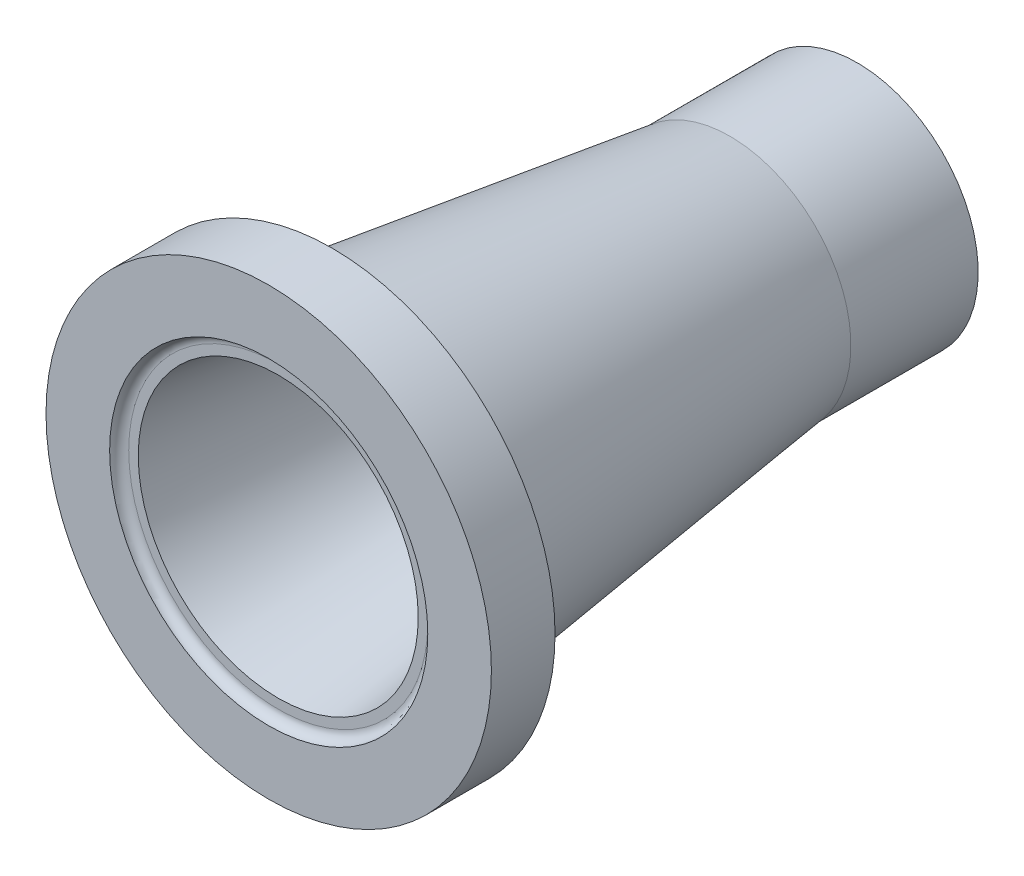
ISO-10303-21;
HEADER;
FILE_DESCRIPTION(('STEP AP214'),'2;1');
FILE_NAME('part.step','',(''),(''),'','','');
FILE_SCHEMA(('AUTOMOTIVE_DESIGN { 1 0 10303 214 1 1 1 1 }'));
ENDSEC;
DATA;
#1=APPLICATION_CONTEXT('core data for automotive mechanical design processes');
#2=APPLICATION_PROTOCOL_DEFINITION('international standard','automotive_design',2000,#1);
#3=PRODUCT_CONTEXT('',#1,'mechanical');
#4=PRODUCT('Part','Part','',(#3));
#5=PRODUCT_RELATED_PRODUCT_CATEGORY('part','',(#4));
#6=PRODUCT_DEFINITION_FORMATION('','',#4);
#7=PRODUCT_DEFINITION_CONTEXT('part definition',#1,'design');
#8=PRODUCT_DEFINITION('design','',#6,#7);
#9=PRODUCT_DEFINITION_SHAPE('','',#8);
#10=(LENGTH_UNIT() NAMED_UNIT(*) SI_UNIT(.MILLI.,.METRE.));
#11=(NAMED_UNIT(*) PLANE_ANGLE_UNIT() SI_UNIT($,.RADIAN.));
#12=(NAMED_UNIT(*) SI_UNIT($,.STERADIAN.) SOLID_ANGLE_UNIT());
#13=UNCERTAINTY_MEASURE_WITH_UNIT(LENGTH_MEASURE(1.E-05),#10,'distance_accuracy_value','');
#14=(GEOMETRIC_REPRESENTATION_CONTEXT(3) GLOBAL_UNCERTAINTY_ASSIGNED_CONTEXT((#13)) GLOBAL_UNIT_ASSIGNED_CONTEXT((#10,
#11,#12)) REPRESENTATION_CONTEXT('',''));
#15=CARTESIAN_POINT('',(0.,0.,0.));
#16=DIRECTION('',(0.,0.,1.));
#17=DIRECTION('',(1.,0.,0.));
#18=AXIS2_PLACEMENT_3D('',#15,#16,#17);
#19=CARTESIAN_POINT('',(50.,0.,0.));
#20=DIRECTION('',(0.,0.,-1.));
#21=DIRECTION('',(-1.,0.,0.));
#22=AXIS2_PLACEMENT_3D('',#19,#20,#21);
#23=PLANE('',#22);
#24=CARTESIAN_POINT('',(0.,0.,0.));
#25=DIRECTION('',(0.,0.,-1.));
#26=DIRECTION('',(-1.,0.,0.));
#27=AXIS2_PLACEMENT_3D('',#24,#25,#26);
#28=CIRCLE('',#27,70.);
#29=CARTESIAN_POINT('',(-70.,0.,0.));
#30=VERTEX_POINT('',#29);
#31=EDGE_CURVE('E76',#30,#30,#28,.T.);
#32=ORIENTED_EDGE('',*,*,#31,.F.);
#33=EDGE_LOOP('',(#32));
#34=FACE_BOUND('',#33,.T.);
#35=CARTESIAN_POINT('',(0.,0.,0.));
#36=DIRECTION('',(0.,0.,-1.));
#37=DIRECTION('',(-1.,0.,0.));
#38=AXIS2_PLACEMENT_3D('',#35,#36,#37);
#39=CIRCLE('',#38,50.);
#40=CARTESIAN_POINT('',(-50.,0.,0.));
#41=VERTEX_POINT('',#40);
#42=EDGE_CURVE('E10',#41,#41,#39,.T.);
#43=ORIENTED_EDGE('',*,*,#42,.T.);
#44=EDGE_LOOP('',(#43));
#45=FACE_BOUND('',#44,.T.);
#46=ADVANCED_FACE('F39',(#34,#45),#23,.F.);
#47=CARTESIAN_POINT('',(0.,0.,0.));
#48=DIRECTION('',(0.,0.,-1.));
#49=DIRECTION('',(-1.,0.,0.));
#50=AXIS2_PLACEMENT_3D('',#47,#48,#49);
#51=TOROIDAL_SURFACE('',#50,47.,3.);
#52=ORIENTED_EDGE('',*,*,#42,.F.);
#53=EDGE_LOOP('',(#52));
#54=FACE_BOUND('',#53,.T.);
#55=CARTESIAN_POINT('',(0.,0.,-3.));
#56=DIRECTION('',(0.,0.,-1.));
#57=DIRECTION('',(-1.,0.,0.));
#58=AXIS2_PLACEMENT_3D('',#55,#56,#57);
#59=CIRCLE('',#58,47.);
#60=CARTESIAN_POINT('',(-47.,0.,-3.));
#61=VERTEX_POINT('',#60);
#62=EDGE_CURVE('E45',#61,#61,#59,.T.);
#63=ORIENTED_EDGE('',*,*,#62,.T.);
#64=EDGE_LOOP('',(#63));
#65=FACE_BOUND('',#64,.T.);
#66=ADVANCED_FACE('F83',(#54,#65),#51,.F.);
#67=CARTESIAN_POINT('',(44.,0.,-3.));
#68=DIRECTION('',(0.,0.,-1.));
#69=DIRECTION('',(-1.,0.,0.));
#70=AXIS2_PLACEMENT_3D('',#67,#68,#69);
#71=PLANE('',#70);
#72=ORIENTED_EDGE('',*,*,#62,.F.);
#73=EDGE_LOOP('',(#72));
#74=FACE_BOUND('',#73,.T.);
#75=CARTESIAN_POINT('',(0.,0.,-3.));
#76=DIRECTION('',(0.,0.,-1.));
#77=DIRECTION('',(-1.,0.,0.));
#78=AXIS2_PLACEMENT_3D('',#75,#76,#77);
#79=CIRCLE('',#78,44.);
#80=CARTESIAN_POINT('',(-44.,0.,-3.));
#81=VERTEX_POINT('',#80);
#82=EDGE_CURVE('E49',#81,#81,#79,.T.);
#83=ORIENTED_EDGE('',*,*,#82,.T.);
#84=EDGE_LOOP('',(#83));
#85=FACE_BOUND('',#84,.T.);
#86=ADVANCED_FACE('F87',(#74,#85),#71,.F.);
#87=CARTESIAN_POINT('',(0.,0.,-145.));
#88=DIRECTION('',(0.,0.,1.));
#89=DIRECTION('',(1.,0.,0.));
#90=AXIS2_PLACEMENT_3D('',#87,#88,#89);
#91=CONICAL_SURFACE('',#90,25.,0.133012786876509);
#92=ORIENTED_EDGE('',*,*,#82,.F.);
#93=EDGE_LOOP('',(#92));
#94=FACE_BOUND('',#93,.T.);
#95=CARTESIAN_POINT('',(0.,0.,-145.));
#96=DIRECTION('',(0.,0.,-1.));
#97=DIRECTION('',(-1.,0.,0.));
#98=AXIS2_PLACEMENT_3D('',#95,#96,#97);
#99=CIRCLE('',#98,25.);
#100=CARTESIAN_POINT('',(-25.,0.,-145.));
#101=VERTEX_POINT('',#100);
#102=EDGE_CURVE('E53',#101,#101,#99,.T.);
#103=ORIENTED_EDGE('',*,*,#102,.T.);
#104=EDGE_LOOP('',(#103));
#105=FACE_BOUND('',#104,.T.);
#106=ADVANCED_FACE('F92',(#94,#105),#91,.F.);
#107=CARTESIAN_POINT('',(0.,0.,-195.70547790521));
#108=DIRECTION('',(0.,0.,-1.));
#109=DIRECTION('',(-1.,0.,0.));
#110=AXIS2_PLACEMENT_3D('',#107,#108,#109);
#111=CYLINDRICAL_SURFACE('',#110,25.);
#112=ORIENTED_EDGE('',*,*,#102,.F.);
#113=EDGE_LOOP('',(#112));
#114=FACE_BOUND('',#113,.T.);
#115=CARTESIAN_POINT('',(0.,0.,-185.));
#116=DIRECTION('',(0.,0.,-1.));
#117=DIRECTION('',(-1.,0.,0.));
#118=AXIS2_PLACEMENT_3D('',#115,#116,#117);
#119=CIRCLE('',#118,25.);
#120=CARTESIAN_POINT('',(-25.,0.,-185.));
#121=VERTEX_POINT('',#120);
#122=EDGE_CURVE('E58',#121,#121,#119,.T.);
#123=ORIENTED_EDGE('',*,*,#122,.T.);
#124=EDGE_LOOP('',(#123));
#125=FACE_BOUND('',#124,.T.);
#126=ADVANCED_FACE('F98',(#114,#125),#111,.F.);
#127=CARTESIAN_POINT('',(25.,0.,-185.));
#128=DIRECTION('',(0.,0.,1.));
#129=DIRECTION('',(1.,0.,0.));
#130=AXIS2_PLACEMENT_3D('',#127,#128,#129);
#131=PLANE('',#130);
#132=ORIENTED_EDGE('',*,*,#122,.F.);
#133=EDGE_LOOP('',(#132));
#134=FACE_BOUND('',#133,.T.);
#135=CARTESIAN_POINT('',(0.,0.,-185.));
#136=DIRECTION('',(0.,0.,-1.));
#137=DIRECTION('',(-1.,0.,0.));
#138=AXIS2_PLACEMENT_3D('',#135,#136,#137);
#139=CIRCLE('',#138,38.);
#140=CARTESIAN_POINT('',(-38.,0.,-185.));
#141=VERTEX_POINT('',#140);
#142=EDGE_CURVE('E61',#141,#141,#139,.T.);
#143=ORIENTED_EDGE('',*,*,#142,.T.);
#144=EDGE_LOOP('',(#143));
#145=FACE_BOUND('',#144,.T.);
#146=ADVANCED_FACE('F102',(#134,#145),#131,.F.);
#147=CARTESIAN_POINT('',(0.,0.,-195.70547790521));
#148=DIRECTION('',(0.,0.,-1.));
#149=DIRECTION('',(-1.,0.,0.));
#150=AXIS2_PLACEMENT_3D('',#147,#148,#149);
#151=CYLINDRICAL_SURFACE('',#150,38.);
#152=ORIENTED_EDGE('',*,*,#142,.F.);
#153=EDGE_LOOP('',(#152));
#154=FACE_BOUND('',#153,.T.);
#155=CARTESIAN_POINT('',(0.,0.,-145.));
#156=DIRECTION('',(0.,0.,-1.));
#157=DIRECTION('',(-1.,0.,0.));
#158=AXIS2_PLACEMENT_3D('',#155,#156,#157);
#159=CIRCLE('',#158,38.);
#160=CARTESIAN_POINT('',(-38.,0.,-145.));
#161=VERTEX_POINT('',#160);
#162=EDGE_CURVE('E64',#161,#161,#159,.T.);
#163=ORIENTED_EDGE('',*,*,#162,.T.);
#164=EDGE_LOOP('',(#163));
#165=FACE_BOUND('',#164,.T.);
#166=ADVANCED_FACE('F106',(#154,#165),#151,.T.);
#167=CARTESIAN_POINT('',(0.,0.,-21.7347581711513));
#168=DIRECTION('',(0.,0.,1.));
#169=DIRECTION('',(1.,0.,0.));
#170=AXIS2_PLACEMENT_3D('',#167,#168,#169);
#171=CONICAL_SURFACE('',#170,54.4932365827333,0.133012786876509);
#172=ORIENTED_EDGE('',*,*,#162,.F.);
#173=EDGE_LOOP('',(#172));
#174=FACE_BOUND('',#173,.T.);
#175=CARTESIAN_POINT('',(0.,0.,-21.7347581711513));
#176=DIRECTION('',(0.,0.,-1.));
#177=DIRECTION('',(-1.,0.,0.));
#178=AXIS2_PLACEMENT_3D('',#175,#176,#177);
#179=CIRCLE('',#178,54.4932365827333);
#180=CARTESIAN_POINT('',(-54.4932365827333,0.,-21.7347581711513));
#181=VERTEX_POINT('',#180);
#182=EDGE_CURVE('E67',#181,#181,#179,.T.);
#183=ORIENTED_EDGE('',*,*,#182,.T.);
#184=EDGE_LOOP('',(#183));
#185=FACE_BOUND('',#184,.T.);
#186=ADVANCED_FACE('F110',(#174,#185),#171,.T.);
#187=CARTESIAN_POINT('',(0.,0.,-22.));
#188=DIRECTION('',(0.,0.,-1.));
#189=DIRECTION('',(-1.,0.,0.));
#190=AXIS2_PLACEMENT_3D('',#187,#188,#189);
#191=TOROIDAL_SURFACE('',#190,56.475570250971,2.);
#192=ORIENTED_EDGE('',*,*,#182,.F.);
#193=EDGE_LOOP('',(#192));
#194=FACE_BOUND('',#193,.T.);
#195=CARTESIAN_POINT('',(0.,0.,-20.));
#196=DIRECTION('',(0.,0.,-1.));
#197=DIRECTION('',(-1.,0.,0.));
#198=AXIS2_PLACEMENT_3D('',#195,#196,#197);
#199=CIRCLE('',#198,56.4755702509711);
#200=CARTESIAN_POINT('',(-56.4755702509711,0.,-20.));
#201=VERTEX_POINT('',#200);
#202=EDGE_CURVE('E70',#201,#201,#199,.T.);
#203=ORIENTED_EDGE('',*,*,#202,.T.);
#204=EDGE_LOOP('',(#203));
#205=FACE_BOUND('',#204,.T.);
#206=ADVANCED_FACE('F114',(#194,#205),#191,.F.);
#207=CARTESIAN_POINT('',(70.,0.,-20.));
#208=DIRECTION('',(0.,0.,1.));
#209=DIRECTION('',(1.,0.,0.));
#210=AXIS2_PLACEMENT_3D('',#207,#208,#209);
#211=PLANE('',#210);
#212=ORIENTED_EDGE('',*,*,#202,.F.);
#213=EDGE_LOOP('',(#212));
#214=FACE_BOUND('',#213,.T.);
#215=CARTESIAN_POINT('',(0.,0.,-20.));
#216=DIRECTION('',(0.,0.,-1.));
#217=DIRECTION('',(-1.,0.,0.));
#218=AXIS2_PLACEMENT_3D('',#215,#216,#217);
#219=CIRCLE('',#218,70.);
#220=CARTESIAN_POINT('',(-70.,0.,-20.));
#221=VERTEX_POINT('',#220);
#222=EDGE_CURVE('E73',#221,#221,#219,.T.);
#223=ORIENTED_EDGE('',*,*,#222,.T.);
#224=EDGE_LOOP('',(#223));
#225=FACE_BOUND('',#224,.T.);
#226=ADVANCED_FACE('F118',(#214,#225),#211,.F.);
#227=CARTESIAN_POINT('',(0.,0.,-195.70547790521));
#228=DIRECTION('',(0.,0.,-1.));
#229=DIRECTION('',(-1.,0.,0.));
#230=AXIS2_PLACEMENT_3D('',#227,#228,#229);
#231=CYLINDRICAL_SURFACE('',#230,70.);
#232=ORIENTED_EDGE('',*,*,#222,.F.);
#233=EDGE_LOOP('',(#232));
#234=FACE_BOUND('',#233,.T.);
#235=ORIENTED_EDGE('',*,*,#31,.T.);
#236=EDGE_LOOP('',(#235));
#237=FACE_BOUND('',#236,.T.);
#238=ADVANCED_FACE('F80',(#234,#237),#231,.T.);
#239=CLOSED_SHELL('',(#46,#66,#86,#106,#126,#146,#166,#186,#206,#226,#238));
#240=MANIFOLD_SOLID_BREP('B2',#239);
#241=ADVANCED_BREP_SHAPE_REPRESENTATION('',(#18,#240),#14);
#242=SHAPE_DEFINITION_REPRESENTATION(#9,#241);
ENDSEC;
END-ISO-10303-21;
